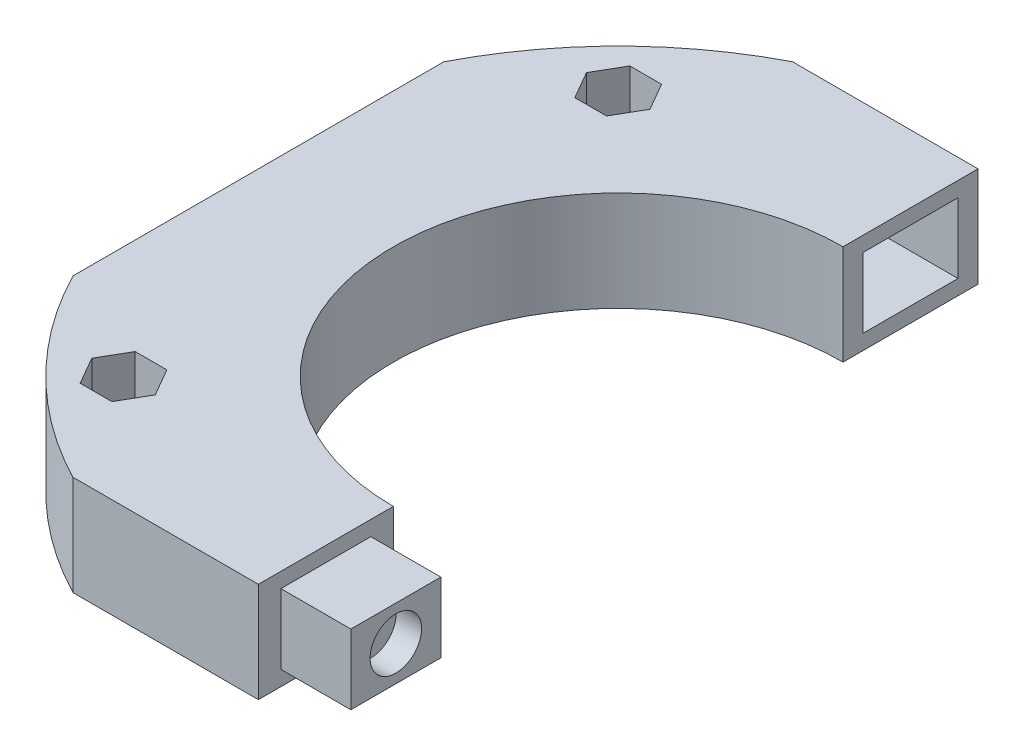
ISO-10303-21;
HEADER;
FILE_DESCRIPTION(('STEP AP214'),'2;1');
FILE_NAME('part.step','',(''),(''),'','','');
FILE_SCHEMA(('AUTOMOTIVE_DESIGN { 1 0 10303 214 1 1 1 1 }'));
ENDSEC;
DATA;
#1=APPLICATION_CONTEXT('core data for automotive mechanical design processes');
#2=APPLICATION_PROTOCOL_DEFINITION('international standard','automotive_design',2000,#1);
#3=PRODUCT_CONTEXT('',#1,'mechanical');
#4=PRODUCT('Part','Part','',(#3));
#5=PRODUCT_RELATED_PRODUCT_CATEGORY('part','',(#4));
#6=PRODUCT_DEFINITION_FORMATION('','',#4);
#7=PRODUCT_DEFINITION_CONTEXT('part definition',#1,'design');
#8=PRODUCT_DEFINITION('design','',#6,#7);
#9=PRODUCT_DEFINITION_SHAPE('','',#8);
#10=(LENGTH_UNIT() NAMED_UNIT(*) SI_UNIT(.MILLI.,.METRE.));
#11=(NAMED_UNIT(*) PLANE_ANGLE_UNIT() SI_UNIT($,.RADIAN.));
#12=(NAMED_UNIT(*) SI_UNIT($,.STERADIAN.) SOLID_ANGLE_UNIT());
#13=UNCERTAINTY_MEASURE_WITH_UNIT(LENGTH_MEASURE(1.E-05),#10,'distance_accuracy_value','');
#14=(GEOMETRIC_REPRESENTATION_CONTEXT(3) GLOBAL_UNCERTAINTY_ASSIGNED_CONTEXT((#13)) GLOBAL_UNIT_ASSIGNED_CONTEXT((#10,
#11,#12)) REPRESENTATION_CONTEXT('',''));
#15=CARTESIAN_POINT('',(0.,0.,0.));
#16=DIRECTION('',(0.,0.,1.));
#17=DIRECTION('',(1.,0.,0.));
#18=AXIS2_PLACEMENT_3D('',#15,#16,#17);
#19=CARTESIAN_POINT('',(0.,-5.,0.));
#20=DIRECTION('',(-1.,0.,0.));
#21=DIRECTION('',(0.,0.,1.));
#22=AXIS2_PLACEMENT_3D('',#19,#20,#21);
#23=PLANE('',#22);
#24=DIRECTION('',(0.,1.,0.));
#25=VECTOR('',#24,1.);
#26=CARTESIAN_POINT('',(0.,-5.,-36.));
#27=LINE('',#26,#25);
#28=CARTESIAN_POINT('',(0.,-5.,-36.));
#29=VERTEX_POINT('',#28);
#30=CARTESIAN_POINT('',(0.,5.,-36.));
#31=VERTEX_POINT('',#30);
#32=EDGE_CURVE('E11',#29,#31,#27,.T.);
#33=ORIENTED_EDGE('',*,*,#32,.T.);
#34=DIRECTION('',(0.,0.,1.));
#35=VECTOR('',#34,1.);
#36=CARTESIAN_POINT('',(0.,5.,0.));
#37=LINE('',#36,#35);
#38=CARTESIAN_POINT('',(0.,5.,-22.5));
#39=VERTEX_POINT('',#38);
#40=EDGE_CURVE('E396',#31,#39,#37,.T.);
#41=ORIENTED_EDGE('',*,*,#40,.T.);
#42=DIRECTION('',(0.,1.,0.));
#43=VECTOR('',#42,1.);
#44=CARTESIAN_POINT('',(0.,-5.,-22.5));
#45=LINE('',#44,#43);
#46=CARTESIAN_POINT('',(0.,-5.,-22.5));
#47=VERTEX_POINT('',#46);
#48=EDGE_CURVE('E54',#47,#39,#45,.T.);
#49=ORIENTED_EDGE('',*,*,#48,.F.);
#50=DIRECTION('',(0.,0.,1.));
#51=VECTOR('',#50,1.);
#52=CARTESIAN_POINT('',(0.,-5.,0.));
#53=LINE('',#52,#51);
#54=EDGE_CURVE('E420',#29,#47,#53,.T.);
#55=ORIENTED_EDGE('',*,*,#54,.F.);
#56=EDGE_LOOP('',(#33,#41,#49,#55));
#57=FACE_BOUND('',#56,.T.);
#58=DIRECTION('',(0.,0.,1.));
#59=VECTOR('',#58,1.);
#60=CARTESIAN_POINT('',(0.,-3.5,-24.5));
#61=LINE('',#60,#59);
#62=CARTESIAN_POINT('',(0.,-3.5,-34.));
#63=VERTEX_POINT('',#62);
#64=CARTESIAN_POINT('',(0.,-3.5,-24.5));
#65=VERTEX_POINT('',#64);
#66=EDGE_CURVE('E251',#63,#65,#61,.T.);
#67=ORIENTED_EDGE('',*,*,#66,.T.);
#68=DIRECTION('',(0.,1.,0.));
#69=VECTOR('',#68,1.);
#70=CARTESIAN_POINT('',(0.,-3.5,-24.5));
#71=LINE('',#70,#69);
#72=CARTESIAN_POINT('',(0.,3.5,-24.5));
#73=VERTEX_POINT('',#72);
#74=EDGE_CURVE('E236',#65,#73,#71,.T.);
#75=ORIENTED_EDGE('',*,*,#74,.T.);
#76=DIRECTION('',(0.,0.,1.));
#77=VECTOR('',#76,1.);
#78=CARTESIAN_POINT('',(0.,3.5,-24.5));
#79=LINE('',#78,#77);
#80=CARTESIAN_POINT('',(0.,3.5,-34.));
#81=VERTEX_POINT('',#80);
#82=EDGE_CURVE('E242',#81,#73,#79,.T.);
#83=ORIENTED_EDGE('',*,*,#82,.F.);
#84=DIRECTION('',(0.,1.,0.));
#85=VECTOR('',#84,1.);
#86=CARTESIAN_POINT('',(0.,-3.5,-34.));
#87=LINE('',#86,#85);
#88=EDGE_CURVE('E644',#63,#81,#87,.T.);
#89=ORIENTED_EDGE('',*,*,#88,.F.);
#90=EDGE_LOOP('',(#67,#75,#83,#89));
#91=FACE_BOUND('',#90,.T.);
#92=ADVANCED_FACE('F45',(#57,#91),#23,.F.);
#93=CARTESIAN_POINT('',(-24.7487373415292,-5.,24.7487373415292));
#94=DIRECTION('',(0.,1.,0.));
#95=DIRECTION('',(0.,0.,1.));
#96=AXIS2_PLACEMENT_3D('',#93,#94,#95);
#97=CYLINDRICAL_SURFACE('',#96,1.5);
#98=CARTESIAN_POINT('',(-24.7487373415292,-5.,24.7487373415292));
#99=DIRECTION('',(0.,1.,0.));
#100=DIRECTION('',(0.,0.,1.));
#101=AXIS2_PLACEMENT_3D('',#98,#99,#100);
#102=CIRCLE('',#101,1.5);
#103=CARTESIAN_POINT('',(-24.7487373415292,-5.,26.2487373415292));
#104=VERTEX_POINT('',#103);
#105=EDGE_CURVE('E399',#104,#104,#102,.T.);
#106=ORIENTED_EDGE('',*,*,#105,.F.);
#107=EDGE_LOOP('',(#106));
#108=FACE_BOUND('',#107,.T.);
#109=CARTESIAN_POINT('',(-24.7487373415292,0.,24.7487373415292));
#110=DIRECTION('',(0.,1.,0.));
#111=DIRECTION('',(0.,0.,1.));
#112=AXIS2_PLACEMENT_3D('',#109,#110,#111);
#113=CIRCLE('',#112,1.5);
#114=CARTESIAN_POINT('',(-24.7487373415292,0.,26.2487373415292));
#115=VERTEX_POINT('',#114);
#116=EDGE_CURVE('E49',#115,#115,#113,.F.);
#117=ORIENTED_EDGE('',*,*,#116,.F.);
#118=EDGE_LOOP('',(#117));
#119=FACE_BOUND('',#118,.T.);
#120=ADVANCED_FACE('F47',(#108,#119),#97,.F.);
#121=CARTESIAN_POINT('',(0.,5.,0.));
#122=DIRECTION('',(0.,1.,0.));
#123=DIRECTION('',(0.,0.,1.));
#124=AXIS2_PLACEMENT_3D('',#121,#122,#123);
#125=PLANE('',#124);
#126=DIRECTION('',(1.,0.,0.));
#127=VECTOR('',#126,1.);
#128=CARTESIAN_POINT('',(0.,5.,-36.));
#129=LINE('',#128,#127);
#130=CARTESIAN_POINT('',(-18.5539753152795,5.,-36.));
#131=VERTEX_POINT('',#130);
#132=EDGE_CURVE('E379',#131,#31,#129,.T.);
#133=ORIENTED_EDGE('',*,*,#132,.F.);
#134=CARTESIAN_POINT('',(0.,5.,0.));
#135=DIRECTION('',(0.,1.,0.));
#136=DIRECTION('',(0.,0.,1.));
#137=AXIS2_PLACEMENT_3D('',#134,#135,#136);
#138=CIRCLE('',#137,40.5);
#139=CARTESIAN_POINT('',(-36.,5.,-18.5539753152794));
#140=VERTEX_POINT('',#139);
#141=EDGE_CURVE('E382',#131,#140,#138,.T.);
#142=ORIENTED_EDGE('',*,*,#141,.T.);
#143=DIRECTION('',(0.,0.,-1.));
#144=VECTOR('',#143,1.);
#145=CARTESIAN_POINT('',(-36.,5.,0.));
#146=LINE('',#145,#144);
#147=CARTESIAN_POINT('',(-36.,5.,18.5539753152795));
#148=VERTEX_POINT('',#147);
#149=EDGE_CURVE('E385',#148,#140,#146,.T.);
#150=ORIENTED_EDGE('',*,*,#149,.F.);
#151=CARTESIAN_POINT('',(-18.5539753152795,5.,36.));
#152=VERTEX_POINT('',#151);
#153=EDGE_CURVE('E386',#148,#152,#138,.T.);
#154=ORIENTED_EDGE('',*,*,#153,.T.);
#155=DIRECTION('',(1.,0.,0.));
#156=VECTOR('',#155,1.);
#157=CARTESIAN_POINT('',(0.,5.,36.));
#158=LINE('',#157,#156);
#159=CARTESIAN_POINT('',(0.,5.,36.));
#160=VERTEX_POINT('',#159);
#161=EDGE_CURVE('E389',#152,#160,#158,.T.);
#162=ORIENTED_EDGE('',*,*,#161,.T.);
#163=CARTESIAN_POINT('',(0.,5.,22.5));
#164=VERTEX_POINT('',#163);
#165=EDGE_CURVE('E392',#164,#160,#37,.T.);
#166=ORIENTED_EDGE('',*,*,#165,.F.);
#167=CARTESIAN_POINT('',(0.,5.,0.));
#168=DIRECTION('',(0.,1.,0.));
#169=DIRECTION('',(0.,0.,1.));
#170=AXIS2_PLACEMENT_3D('',#167,#168,#169);
#171=CIRCLE('',#170,22.5);
#172=EDGE_CURVE('E395',#39,#164,#171,.T.);
#173=ORIENTED_EDGE('',*,*,#172,.F.);
#174=ORIENTED_EDGE('',*,*,#40,.F.);
#175=EDGE_LOOP('',(#133,#142,#150,#154,#162,#166,#173,#174));
#176=FACE_BOUND('',#175,.T.);
#177=DIRECTION('',(-0.500000000000006,0.,-0.866025403784435));
#178=VECTOR('',#177,1.);
#179=CARTESIAN_POINT('',(-21.5733108609862,5.,-24.7487373415292));
#180=LINE('',#179,#178);
#181=CARTESIAN_POINT('',(-21.5733108609862,5.,-24.7487373415292));
#182=VERTEX_POINT('',#181);
#183=CARTESIAN_POINT('',(-23.1610241012577,5.,-27.4987373415292));
#184=VERTEX_POINT('',#183);
#185=EDGE_CURVE('E350',#182,#184,#180,.T.);
#186=ORIENTED_EDGE('',*,*,#185,.F.);
#187=DIRECTION('',(0.499999999999994,0.,-0.866025403784442));
#188=VECTOR('',#187,1.);
#189=CARTESIAN_POINT('',(-23.1610241012577,5.,-21.9987373415292));
#190=LINE('',#189,#188);
#191=CARTESIAN_POINT('',(-23.1610241012577,5.,-21.9987373415292));
#192=VERTEX_POINT('',#191);
#193=EDGE_CURVE('E334',#192,#182,#190,.T.);
#194=ORIENTED_EDGE('',*,*,#193,.F.);
#195=DIRECTION('',(1.,0.,0.));
#196=VECTOR('',#195,1.);
#197=CARTESIAN_POINT('',(-26.3364505818006,5.,-21.9987373415292));
#198=LINE('',#197,#196);
#199=CARTESIAN_POINT('',(-26.3364505818006,5.,-21.9987373415292));
#200=VERTEX_POINT('',#199);
#201=EDGE_CURVE('E361',#200,#192,#198,.T.);
#202=ORIENTED_EDGE('',*,*,#201,.F.);
#203=DIRECTION('',(0.500000000000006,0.,0.866025403784435));
#204=VECTOR('',#203,1.);
#205=CARTESIAN_POINT('',(-27.9241638220721,5.,-24.7487373415291));
#206=LINE('',#205,#204);
#207=CARTESIAN_POINT('',(-27.9241638220721,5.,-24.7487373415291));
#208=VERTEX_POINT('',#207);
#209=EDGE_CURVE('E358',#208,#200,#206,.T.);
#210=ORIENTED_EDGE('',*,*,#209,.F.);
#211=DIRECTION('',(-0.499999999999993,0.,0.866025403784443));
#212=VECTOR('',#211,1.);
#213=CARTESIAN_POINT('',(-26.3364505818006,5.,-27.4987373415292));
#214=LINE('',#213,#212);
#215=CARTESIAN_POINT('',(-26.3364505818006,5.,-27.4987373415292));
#216=VERTEX_POINT('',#215);
#217=EDGE_CURVE('E355',#216,#208,#214,.T.);
#218=ORIENTED_EDGE('',*,*,#217,.F.);
#219=DIRECTION('',(-1.,0.,0.));
#220=VECTOR('',#219,1.);
#221=CARTESIAN_POINT('',(-23.1610241012577,5.,-27.4987373415292));
#222=LINE('',#221,#220);
#223=EDGE_CURVE('E352',#184,#216,#222,.T.);
#224=ORIENTED_EDGE('',*,*,#223,.F.);
#225=EDGE_LOOP('',(#186,#194,#202,#210,#218,#224));
#226=FACE_BOUND('',#225,.T.);
#227=DIRECTION('',(0.499999999999994,0.,0.866025403784442));
#228=VECTOR('',#227,1.);
#229=CARTESIAN_POINT('',(-23.1610241012577,5.,21.9987373415292));
#230=LINE('',#229,#228);
#231=CARTESIAN_POINT('',(-23.1610241012577,5.,21.9987373415292));
#232=VERTEX_POINT('',#231);
#233=CARTESIAN_POINT('',(-21.5733108609862,5.,24.7487373415292));
#234=VERTEX_POINT('',#233);
#235=EDGE_CURVE('E303',#232,#234,#230,.T.);
#236=ORIENTED_EDGE('',*,*,#235,.T.);
#237=DIRECTION('',(-0.500000000000006,0.,0.866025403784435));
#238=VECTOR('',#237,1.);
#239=CARTESIAN_POINT('',(-21.5733108609862,5.,24.7487373415292));
#240=LINE('',#239,#238);
#241=CARTESIAN_POINT('',(-23.1610241012577,5.,27.4987373415292));
#242=VERTEX_POINT('',#241);
#243=EDGE_CURVE('E285',#234,#242,#240,.T.);
#244=ORIENTED_EDGE('',*,*,#243,.T.);
#245=DIRECTION('',(-1.,0.,0.));
#246=VECTOR('',#245,1.);
#247=CARTESIAN_POINT('',(-23.1610241012577,5.,27.4987373415292));
#248=LINE('',#247,#246);
#249=CARTESIAN_POINT('',(-26.3364505818006,5.,27.4987373415292));
#250=VERTEX_POINT('',#249);
#251=EDGE_CURVE('E290',#242,#250,#248,.T.);
#252=ORIENTED_EDGE('',*,*,#251,.T.);
#253=DIRECTION('',(-0.499999999999993,0.,-0.866025403784443));
#254=VECTOR('',#253,1.);
#255=CARTESIAN_POINT('',(-26.3364505818006,5.,27.4987373415292));
#256=LINE('',#255,#254);
#257=CARTESIAN_POINT('',(-27.9241638220721,5.,24.7487373415291));
#258=VERTEX_POINT('',#257);
#259=EDGE_CURVE('E312',#250,#258,#256,.T.);
#260=ORIENTED_EDGE('',*,*,#259,.T.);
#261=DIRECTION('',(0.500000000000006,0.,-0.866025403784435));
#262=VECTOR('',#261,1.);
#263=CARTESIAN_POINT('',(-27.9241638220721,5.,24.7487373415291));
#264=LINE('',#263,#262);
#265=CARTESIAN_POINT('',(-26.3364505818006,5.,21.9987373415292));
#266=VERTEX_POINT('',#265);
#267=EDGE_CURVE('E309',#258,#266,#264,.T.);
#268=ORIENTED_EDGE('',*,*,#267,.T.);
#269=DIRECTION('',(1.,0.,0.));
#270=VECTOR('',#269,1.);
#271=CARTESIAN_POINT('',(-26.3364505818006,5.,21.9987373415292));
#272=LINE('',#271,#270);
#273=EDGE_CURVE('E306',#266,#232,#272,.T.);
#274=ORIENTED_EDGE('',*,*,#273,.T.);
#275=EDGE_LOOP('',(#236,#244,#252,#260,#268,#274));
#276=FACE_BOUND('',#275,.T.);
#277=ADVANCED_FACE('F442',(#176,#226,#276),#125,.T.);
#278=CARTESIAN_POINT('',(-24.7487373415292,-5.,-24.7487373415292));
#279=DIRECTION('',(0.,1.,0.));
#280=DIRECTION('',(0.,0.,1.));
#281=AXIS2_PLACEMENT_3D('',#278,#279,#280);
#282=CYLINDRICAL_SURFACE('',#281,1.5);
#283=CARTESIAN_POINT('',(-24.7487373415292,-5.,-24.7487373415292));
#284=DIRECTION('',(0.,1.,0.));
#285=DIRECTION('',(0.,0.,1.));
#286=AXIS2_PLACEMENT_3D('',#283,#284,#285);
#287=CIRCLE('',#286,1.5);
#288=CARTESIAN_POINT('',(-24.7487373415292,-5.,-23.2487373415292));
#289=VERTEX_POINT('',#288);
#290=EDGE_CURVE('E402',#289,#289,#287,.T.);
#291=ORIENTED_EDGE('',*,*,#290,.F.);
#292=EDGE_LOOP('',(#291));
#293=FACE_BOUND('',#292,.T.);
#294=CARTESIAN_POINT('',(-24.7487373415292,0.,-24.7487373415292));
#295=DIRECTION('',(0.,1.,0.));
#296=DIRECTION('',(0.,0.,1.));
#297=AXIS2_PLACEMENT_3D('',#294,#295,#296);
#298=CIRCLE('',#297,1.5);
#299=CARTESIAN_POINT('',(-24.7487373415292,0.,-23.2487373415292));
#300=VERTEX_POINT('',#299);
#301=EDGE_CURVE('E368',#300,#300,#298,.F.);
#302=ORIENTED_EDGE('',*,*,#301,.F.);
#303=EDGE_LOOP('',(#302));
#304=FACE_BOUND('',#303,.T.);
#305=ADVANCED_FACE('F439',(#293,#304),#282,.F.);
#306=CARTESIAN_POINT('',(0.,-5.,-36.));
#307=DIRECTION('',(0.,0.,1.));
#308=DIRECTION('',(1.,0.,0.));
#309=AXIS2_PLACEMENT_3D('',#306,#307,#308);
#310=PLANE('',#309);
#311=DIRECTION('',(0.,1.,0.));
#312=VECTOR('',#311,1.);
#313=CARTESIAN_POINT('',(-18.5539753152795,-5.,-36.));
#314=LINE('',#313,#312);
#315=CARTESIAN_POINT('',(-18.5539753152795,-5.,-36.));
#316=VERTEX_POINT('',#315);
#317=EDGE_CURVE('E433',#316,#131,#314,.T.);
#318=ORIENTED_EDGE('',*,*,#317,.T.);
#319=ORIENTED_EDGE('',*,*,#132,.T.);
#320=ORIENTED_EDGE('',*,*,#32,.F.);
#321=DIRECTION('',(1.,0.,0.));
#322=VECTOR('',#321,1.);
#323=CARTESIAN_POINT('',(0.,-5.,-36.));
#324=LINE('',#323,#322);
#325=EDGE_CURVE('E405',#316,#29,#324,.T.);
#326=ORIENTED_EDGE('',*,*,#325,.F.);
#327=EDGE_LOOP('',(#318,#319,#320,#326));
#328=FACE_BOUND('',#327,.T.);
#329=ADVANCED_FACE('F441',(#328),#310,.F.);
#330=CARTESIAN_POINT('',(0.,-5.,0.));
#331=DIRECTION('',(0.,1.,0.));
#332=DIRECTION('',(0.,0.,1.));
#333=AXIS2_PLACEMENT_3D('',#330,#331,#332);
#334=CYLINDRICAL_SURFACE('',#333,22.5);
#335=ORIENTED_EDGE('',*,*,#48,.T.);
#336=ORIENTED_EDGE('',*,*,#172,.T.);
#337=DIRECTION('',(0.,1.,0.));
#338=VECTOR('',#337,1.);
#339=CARTESIAN_POINT('',(0.,-5.,22.5));
#340=LINE('',#339,#338);
#341=CARTESIAN_POINT('',(0.,-5.,22.5));
#342=VERTEX_POINT('',#341);
#343=EDGE_CURVE('E423',#342,#164,#340,.T.);
#344=ORIENTED_EDGE('',*,*,#343,.F.);
#345=CARTESIAN_POINT('',(0.,-5.,0.));
#346=DIRECTION('',(0.,1.,0.));
#347=DIRECTION('',(0.,0.,1.));
#348=AXIS2_PLACEMENT_3D('',#345,#346,#347);
#349=CIRCLE('',#348,22.5);
#350=EDGE_CURVE('E419',#47,#342,#349,.T.);
#351=ORIENTED_EDGE('',*,*,#350,.F.);
#352=EDGE_LOOP('',(#335,#336,#344,#351));
#353=FACE_BOUND('',#352,.T.);
#354=ADVANCED_FACE('F449',(#353),#334,.F.);
#355=DIRECTION('',(0.,-1.,0.));
#356=VECTOR('',#355,1.);
#357=CARTESIAN_POINT('',(0.,3.5,33.75));
#358=LINE('',#357,#356);
#359=CARTESIAN_POINT('',(0.,3.5,33.75));
#360=VERTEX_POINT('',#359);
#361=CARTESIAN_POINT('',(0.,-3.5,33.75));
#362=VERTEX_POINT('',#361);
#363=EDGE_CURVE('E70',#360,#362,#358,.T.);
#364=ORIENTED_EDGE('',*,*,#363,.F.);
#365=DIRECTION('',(0.,0.,1.));
#366=VECTOR('',#365,1.);
#367=CARTESIAN_POINT('',(0.,3.5,24.75));
#368=LINE('',#367,#366);
#369=CARTESIAN_POINT('',(0.,3.5,24.75));
#370=VERTEX_POINT('',#369);
#371=EDGE_CURVE('E268',#370,#360,#368,.T.);
#372=ORIENTED_EDGE('',*,*,#371,.F.);
#373=DIRECTION('',(0.,-1.,0.));
#374=VECTOR('',#373,1.);
#375=CARTESIAN_POINT('',(0.,3.5,24.75));
#376=LINE('',#375,#374);
#377=CARTESIAN_POINT('',(0.,-3.5,24.75));
#378=VERTEX_POINT('',#377);
#379=EDGE_CURVE('E278',#370,#378,#376,.T.);
#380=ORIENTED_EDGE('',*,*,#379,.T.);
#381=DIRECTION('',(0.,0.,1.));
#382=VECTOR('',#381,1.);
#383=CARTESIAN_POINT('',(0.,-3.5,24.75));
#384=LINE('',#383,#382);
#385=EDGE_CURVE('E252',#378,#362,#384,.T.);
#386=ORIENTED_EDGE('',*,*,#385,.T.);
#387=EDGE_LOOP('',(#364,#372,#380,#386));
#388=FACE_BOUND('',#387,.T.);
#389=ORIENTED_EDGE('',*,*,#343,.T.);
#390=ORIENTED_EDGE('',*,*,#165,.T.);
#391=DIRECTION('',(0.,1.,0.));
#392=VECTOR('',#391,1.);
#393=CARTESIAN_POINT('',(0.,-5.,36.));
#394=LINE('',#393,#392);
#395=CARTESIAN_POINT('',(0.,-5.,36.));
#396=VERTEX_POINT('',#395);
#397=EDGE_CURVE('E425',#396,#160,#394,.T.);
#398=ORIENTED_EDGE('',*,*,#397,.F.);
#399=EDGE_CURVE('E417',#342,#396,#53,.T.);
#400=ORIENTED_EDGE('',*,*,#399,.F.);
#401=EDGE_LOOP('',(#389,#390,#398,#400));
#402=FACE_BOUND('',#401,.T.);
#403=ADVANCED_FACE('F459',(#388,#402),#23,.F.);
#404=CARTESIAN_POINT('',(0.,-5.,36.));
#405=DIRECTION('',(0.,0.,1.));
#406=DIRECTION('',(1.,0.,0.));
#407=AXIS2_PLACEMENT_3D('',#404,#405,#406);
#408=PLANE('',#407);
#409=ORIENTED_EDGE('',*,*,#397,.T.);
#410=ORIENTED_EDGE('',*,*,#161,.F.);
#411=DIRECTION('',(0.,1.,0.));
#412=VECTOR('',#411,1.);
#413=CARTESIAN_POINT('',(-18.5539753152795,-5.,36.));
#414=LINE('',#413,#412);
#415=CARTESIAN_POINT('',(-18.5539753152795,-5.,36.));
#416=VERTEX_POINT('',#415);
#417=EDGE_CURVE('E427',#416,#152,#414,.T.);
#418=ORIENTED_EDGE('',*,*,#417,.F.);
#419=DIRECTION('',(1.,0.,0.));
#420=VECTOR('',#419,1.);
#421=CARTESIAN_POINT('',(0.,-5.,36.));
#422=LINE('',#421,#420);
#423=EDGE_CURVE('E414',#416,#396,#422,.T.);
#424=ORIENTED_EDGE('',*,*,#423,.T.);
#425=EDGE_LOOP('',(#409,#410,#418,#424));
#426=FACE_BOUND('',#425,.T.);
#427=ADVANCED_FACE('F469',(#426),#408,.T.);
#428=CARTESIAN_POINT('',(0.,-5.,0.));
#429=DIRECTION('',(0.,1.,0.));
#430=DIRECTION('',(0.,0.,1.));
#431=AXIS2_PLACEMENT_3D('',#428,#429,#430);
#432=CYLINDRICAL_SURFACE('',#431,40.5);
#433=ORIENTED_EDGE('',*,*,#417,.T.);
#434=ORIENTED_EDGE('',*,*,#153,.F.);
#435=DIRECTION('',(0.,1.,0.));
#436=VECTOR('',#435,1.);
#437=CARTESIAN_POINT('',(-36.,-5.,18.5539753152795));
#438=LINE('',#437,#436);
#439=CARTESIAN_POINT('',(-36.,-5.,18.5539753152795));
#440=VERTEX_POINT('',#439);
#441=EDGE_CURVE('E429',#440,#148,#438,.T.);
#442=ORIENTED_EDGE('',*,*,#441,.F.);
#443=CARTESIAN_POINT('',(0.,-5.,0.));
#444=DIRECTION('',(0.,1.,0.));
#445=DIRECTION('',(0.,0.,1.));
#446=AXIS2_PLACEMENT_3D('',#443,#444,#445);
#447=CIRCLE('',#446,40.5);
#448=EDGE_CURVE('E412',#440,#416,#447,.T.);
#449=ORIENTED_EDGE('',*,*,#448,.T.);
#450=EDGE_LOOP('',(#433,#434,#442,#449));
#451=FACE_BOUND('',#450,.T.);
#452=ADVANCED_FACE('F475',(#451),#432,.T.);
#453=CARTESIAN_POINT('',(-36.,-5.,0.));
#454=DIRECTION('',(1.,0.,0.));
#455=DIRECTION('',(0.,0.,-1.));
#456=AXIS2_PLACEMENT_3D('',#453,#454,#455);
#457=PLANE('',#456);
#458=ORIENTED_EDGE('',*,*,#441,.T.);
#459=ORIENTED_EDGE('',*,*,#149,.T.);
#460=DIRECTION('',(0.,1.,0.));
#461=VECTOR('',#460,1.);
#462=CARTESIAN_POINT('',(-36.,-5.,-18.5539753152794));
#463=LINE('',#462,#461);
#464=CARTESIAN_POINT('',(-36.,-5.,-18.5539753152794));
#465=VERTEX_POINT('',#464);
#466=EDGE_CURVE('E431',#465,#140,#463,.T.);
#467=ORIENTED_EDGE('',*,*,#466,.F.);
#468=DIRECTION('',(0.,0.,-1.));
#469=VECTOR('',#468,1.);
#470=CARTESIAN_POINT('',(-36.,-5.,0.));
#471=LINE('',#470,#469);
#472=EDGE_CURVE('E411',#440,#465,#471,.T.);
#473=ORIENTED_EDGE('',*,*,#472,.F.);
#474=EDGE_LOOP('',(#458,#459,#467,#473));
#475=FACE_BOUND('',#474,.T.);
#476=ADVANCED_FACE('F504',(#475),#457,.F.);
#477=ORIENTED_EDGE('',*,*,#466,.T.);
#478=ORIENTED_EDGE('',*,*,#141,.F.);
#479=ORIENTED_EDGE('',*,*,#317,.F.);
#480=EDGE_CURVE('E408',#316,#465,#447,.T.);
#481=ORIENTED_EDGE('',*,*,#480,.T.);
#482=EDGE_LOOP('',(#477,#478,#479,#481));
#483=FACE_BOUND('',#482,.T.);
#484=ADVANCED_FACE('F500',(#483),#432,.T.);
#485=CARTESIAN_POINT('',(0.,-5.,0.));
#486=DIRECTION('',(0.,1.,0.));
#487=DIRECTION('',(0.,0.,1.));
#488=AXIS2_PLACEMENT_3D('',#485,#486,#487);
#489=PLANE('',#488);
#490=ORIENTED_EDGE('',*,*,#105,.T.);
#491=EDGE_LOOP('',(#490));
#492=FACE_BOUND('',#491,.T.);
#493=ORIENTED_EDGE('',*,*,#290,.T.);
#494=EDGE_LOOP('',(#493));
#495=FACE_BOUND('',#494,.T.);
#496=ORIENTED_EDGE('',*,*,#325,.T.);
#497=ORIENTED_EDGE('',*,*,#54,.T.);
#498=ORIENTED_EDGE('',*,*,#350,.T.);
#499=ORIENTED_EDGE('',*,*,#399,.T.);
#500=ORIENTED_EDGE('',*,*,#423,.F.);
#501=ORIENTED_EDGE('',*,*,#448,.F.);
#502=ORIENTED_EDGE('',*,*,#472,.T.);
#503=ORIENTED_EDGE('',*,*,#480,.F.);
#504=EDGE_LOOP('',(#496,#497,#498,#499,#500,#501,#502,#503));
#505=FACE_BOUND('',#504,.T.);
#506=ADVANCED_FACE('F511',(#492,#495,#505),#489,.F.);
#507=CARTESIAN_POINT('',(0.,0.,0.));
#508=DIRECTION('',(0.,1.,0.));
#509=DIRECTION('',(0.,0.,1.));
#510=AXIS2_PLACEMENT_3D('',#507,#508,#509);
#511=PLANE('',#510);
#512=DIRECTION('',(-0.500000000000006,0.,-0.866025403784435));
#513=VECTOR('',#512,1.);
#514=CARTESIAN_POINT('',(-21.5733108609862,0.,-24.7487373415292));
#515=LINE('',#514,#513);
#516=CARTESIAN_POINT('',(-21.5733108609862,0.,-24.7487373415292));
#517=VERTEX_POINT('',#516);
#518=CARTESIAN_POINT('',(-23.1610241012577,0.,-27.4987373415292));
#519=VERTEX_POINT('',#518);
#520=EDGE_CURVE('E330',#517,#519,#515,.T.);
#521=ORIENTED_EDGE('',*,*,#520,.T.);
#522=DIRECTION('',(-1.,0.,0.));
#523=VECTOR('',#522,1.);
#524=CARTESIAN_POINT('',(-23.1610241012577,0.,-27.4987373415292));
#525=LINE('',#524,#523);
#526=CARTESIAN_POINT('',(-26.3364505818006,0.,-27.4987373415292));
#527=VERTEX_POINT('',#526);
#528=EDGE_CURVE('E333',#519,#527,#525,.T.);
#529=ORIENTED_EDGE('',*,*,#528,.T.);
#530=DIRECTION('',(-0.499999999999993,0.,0.866025403784443));
#531=VECTOR('',#530,1.);
#532=CARTESIAN_POINT('',(-26.3364505818006,0.,-27.4987373415292));
#533=LINE('',#532,#531);
#534=CARTESIAN_POINT('',(-27.9241638220721,0.,-24.7487373415291));
#535=VERTEX_POINT('',#534);
#536=EDGE_CURVE('E337',#527,#535,#533,.T.);
#537=ORIENTED_EDGE('',*,*,#536,.T.);
#538=DIRECTION('',(0.500000000000006,0.,0.866025403784435));
#539=VECTOR('',#538,1.);
#540=CARTESIAN_POINT('',(-27.9241638220721,0.,-24.7487373415291));
#541=LINE('',#540,#539);
#542=CARTESIAN_POINT('',(-26.3364505818006,0.,-21.9987373415292));
#543=VERTEX_POINT('',#542);
#544=EDGE_CURVE('E340',#535,#543,#541,.T.);
#545=ORIENTED_EDGE('',*,*,#544,.T.);
#546=DIRECTION('',(1.,0.,0.));
#547=VECTOR('',#546,1.);
#548=CARTESIAN_POINT('',(-26.3364505818006,0.,-21.9987373415292));
#549=LINE('',#548,#547);
#550=CARTESIAN_POINT('',(-23.1610241012577,0.,-21.9987373415292));
#551=VERTEX_POINT('',#550);
#552=EDGE_CURVE('E343',#543,#551,#549,.T.);
#553=ORIENTED_EDGE('',*,*,#552,.T.);
#554=DIRECTION('',(0.499999999999994,0.,-0.866025403784442));
#555=VECTOR('',#554,1.);
#556=CARTESIAN_POINT('',(-23.1610241012577,0.,-21.9987373415292));
#557=LINE('',#556,#555);
#558=EDGE_CURVE('E346',#551,#517,#557,.T.);
#559=ORIENTED_EDGE('',*,*,#558,.T.);
#560=EDGE_LOOP('',(#521,#529,#537,#545,#553,#559));
#561=FACE_BOUND('',#560,.T.);
#562=ORIENTED_EDGE('',*,*,#301,.T.);
#563=EDGE_LOOP('',(#562));
#564=FACE_BOUND('',#563,.T.);
#565=ADVANCED_FACE('F437',(#561,#564),#511,.T.);
#566=CARTESIAN_POINT('',(-21.5733108609862,0.,-24.7487373415292));
#567=DIRECTION('',(0.866025403784435,0.,-0.500000000000006));
#568=DIRECTION('',(-0.500000000000007,0.,-0.866025403784435));
#569=AXIS2_PLACEMENT_3D('',#566,#567,#568);
#570=PLANE('',#569);
#571=ORIENTED_EDGE('',*,*,#185,.T.);
#572=DIRECTION('',(0.,1.,0.));
#573=VECTOR('',#572,1.);
#574=CARTESIAN_POINT('',(-23.1610241012577,0.,-27.4987373415292));
#575=LINE('',#574,#573);
#576=EDGE_CURVE('E349',#519,#184,#575,.T.);
#577=ORIENTED_EDGE('',*,*,#576,.F.);
#578=ORIENTED_EDGE('',*,*,#520,.F.);
#579=DIRECTION('',(0.,1.,0.));
#580=VECTOR('',#579,1.);
#581=CARTESIAN_POINT('',(-21.5733108609862,0.,-24.7487373415292));
#582=LINE('',#581,#580);
#583=EDGE_CURVE('E366',#517,#182,#582,.T.);
#584=ORIENTED_EDGE('',*,*,#583,.T.);
#585=EDGE_LOOP('',(#571,#577,#578,#584));
#586=FACE_BOUND('',#585,.T.);
#587=ADVANCED_FACE('F516',(#586),#570,.F.);
#588=CARTESIAN_POINT('',(-23.1610241012577,0.,-21.9987373415292));
#589=DIRECTION('',(0.866025403784442,0.,0.499999999999994));
#590=DIRECTION('',(0.499999999999994,0.,-0.866025403784442));
#591=AXIS2_PLACEMENT_3D('',#588,#589,#590);
#592=PLANE('',#591);
#593=ORIENTED_EDGE('',*,*,#193,.T.);
#594=ORIENTED_EDGE('',*,*,#583,.F.);
#595=ORIENTED_EDGE('',*,*,#558,.F.);
#596=DIRECTION('',(0.,1.,0.));
#597=VECTOR('',#596,1.);
#598=CARTESIAN_POINT('',(-23.1610241012577,0.,-21.9987373415292));
#599=LINE('',#598,#597);
#600=EDGE_CURVE('E369',#551,#192,#599,.T.);
#601=ORIENTED_EDGE('',*,*,#600,.T.);
#602=EDGE_LOOP('',(#593,#594,#595,#601));
#603=FACE_BOUND('',#602,.T.);
#604=ADVANCED_FACE('F524',(#603),#592,.F.);
#605=CARTESIAN_POINT('',(-26.3364505818006,0.,-21.9987373415292));
#606=DIRECTION('',(0.,0.,1.));
#607=DIRECTION('',(1.,0.,0.));
#608=AXIS2_PLACEMENT_3D('',#605,#606,#607);
#609=PLANE('',#608);
#610=ORIENTED_EDGE('',*,*,#201,.T.);
#611=ORIENTED_EDGE('',*,*,#600,.F.);
#612=ORIENTED_EDGE('',*,*,#552,.F.);
#613=DIRECTION('',(0.,1.,0.));
#614=VECTOR('',#613,1.);
#615=CARTESIAN_POINT('',(-26.3364505818006,0.,-21.9987373415292));
#616=LINE('',#615,#614);
#617=EDGE_CURVE('E371',#543,#200,#616,.T.);
#618=ORIENTED_EDGE('',*,*,#617,.T.);
#619=EDGE_LOOP('',(#610,#611,#612,#618));
#620=FACE_BOUND('',#619,.T.);
#621=ADVANCED_FACE('F538',(#620),#609,.F.);
#622=CARTESIAN_POINT('',(-27.9241638220721,0.,-24.7487373415291));
#623=DIRECTION('',(-0.866025403784435,0.,0.500000000000006));
#624=DIRECTION('',(0.500000000000006,0.,0.866025403784435));
#625=AXIS2_PLACEMENT_3D('',#622,#623,#624);
#626=PLANE('',#625);
#627=ORIENTED_EDGE('',*,*,#209,.T.);
#628=ORIENTED_EDGE('',*,*,#617,.F.);
#629=ORIENTED_EDGE('',*,*,#544,.F.);
#630=DIRECTION('',(0.,1.,0.));
#631=VECTOR('',#630,1.);
#632=CARTESIAN_POINT('',(-27.9241638220721,0.,-24.7487373415291));
#633=LINE('',#632,#631);
#634=EDGE_CURVE('E373',#535,#208,#633,.T.);
#635=ORIENTED_EDGE('',*,*,#634,.T.);
#636=EDGE_LOOP('',(#627,#628,#629,#635));
#637=FACE_BOUND('',#636,.T.);
#638=ADVANCED_FACE('F534',(#637),#626,.F.);
#639=CARTESIAN_POINT('',(-26.3364505818006,0.,-27.4987373415292));
#640=DIRECTION('',(-0.866025403784442,0.,-0.499999999999993));
#641=DIRECTION('',(-0.499999999999993,0.,0.866025403784442));
#642=AXIS2_PLACEMENT_3D('',#639,#640,#641);
#643=PLANE('',#642);
#644=ORIENTED_EDGE('',*,*,#217,.T.);
#645=ORIENTED_EDGE('',*,*,#634,.F.);
#646=ORIENTED_EDGE('',*,*,#536,.F.);
#647=DIRECTION('',(0.,1.,0.));
#648=VECTOR('',#647,1.);
#649=CARTESIAN_POINT('',(-26.3364505818006,0.,-27.4987373415292));
#650=LINE('',#649,#648);
#651=EDGE_CURVE('E375',#527,#216,#650,.T.);
#652=ORIENTED_EDGE('',*,*,#651,.T.);
#653=EDGE_LOOP('',(#644,#645,#646,#652));
#654=FACE_BOUND('',#653,.T.);
#655=ADVANCED_FACE('F530',(#654),#643,.F.);
#656=CARTESIAN_POINT('',(-23.1610241012577,0.,-27.4987373415292));
#657=DIRECTION('',(0.,0.,-1.));
#658=DIRECTION('',(-1.,0.,0.));
#659=AXIS2_PLACEMENT_3D('',#656,#657,#658);
#660=PLANE('',#659);
#661=ORIENTED_EDGE('',*,*,#223,.T.);
#662=ORIENTED_EDGE('',*,*,#651,.F.);
#663=ORIENTED_EDGE('',*,*,#528,.F.);
#664=ORIENTED_EDGE('',*,*,#576,.T.);
#665=EDGE_LOOP('',(#661,#662,#663,#664));
#666=FACE_BOUND('',#665,.T.);
#667=ADVANCED_FACE('F526',(#666),#660,.F.);
#668=CARTESIAN_POINT('',(0.,0.,0.));
#669=DIRECTION('',(0.,1.,0.));
#670=DIRECTION('',(0.,0.,-1.));
#671=AXIS2_PLACEMENT_3D('',#668,#669,#670);
#672=PLANE('',#671);
#673=DIRECTION('',(-0.500000000000006,0.,0.866025403784435));
#674=VECTOR('',#673,1.);
#675=CARTESIAN_POINT('',(-21.5733108609862,0.,24.7487373415292));
#676=LINE('',#675,#674);
#677=CARTESIAN_POINT('',(-21.5733108609862,0.,24.7487373415292));
#678=VERTEX_POINT('',#677);
#679=CARTESIAN_POINT('',(-23.1610241012577,0.,27.4987373415292));
#680=VERTEX_POINT('',#679);
#681=EDGE_CURVE('E286',#678,#680,#676,.T.);
#682=ORIENTED_EDGE('',*,*,#681,.F.);
#683=DIRECTION('',(0.499999999999994,0.,0.866025403784442));
#684=VECTOR('',#683,1.);
#685=CARTESIAN_POINT('',(-23.1610241012577,0.,21.9987373415292));
#686=LINE('',#685,#684);
#687=CARTESIAN_POINT('',(-23.1610241012577,0.,21.9987373415292));
#688=VERTEX_POINT('',#687);
#689=EDGE_CURVE('E289',#688,#678,#686,.T.);
#690=ORIENTED_EDGE('',*,*,#689,.F.);
#691=DIRECTION('',(1.,0.,0.));
#692=VECTOR('',#691,1.);
#693=CARTESIAN_POINT('',(-26.3364505818006,0.,21.9987373415292));
#694=LINE('',#693,#692);
#695=CARTESIAN_POINT('',(-26.3364505818006,0.,21.9987373415292));
#696=VERTEX_POINT('',#695);
#697=EDGE_CURVE('E292',#696,#688,#694,.T.);
#698=ORIENTED_EDGE('',*,*,#697,.F.);
#699=DIRECTION('',(0.500000000000006,0.,-0.866025403784435));
#700=VECTOR('',#699,1.);
#701=CARTESIAN_POINT('',(-27.9241638220721,0.,24.7487373415291));
#702=LINE('',#701,#700);
#703=CARTESIAN_POINT('',(-27.9241638220721,0.,24.7487373415291));
#704=VERTEX_POINT('',#703);
#705=EDGE_CURVE('E294',#704,#696,#702,.T.);
#706=ORIENTED_EDGE('',*,*,#705,.F.);
#707=DIRECTION('',(-0.499999999999993,0.,-0.866025403784443));
#708=VECTOR('',#707,1.);
#709=CARTESIAN_POINT('',(-26.3364505818006,0.,27.4987373415292));
#710=LINE('',#709,#708);
#711=CARTESIAN_POINT('',(-26.3364505818006,0.,27.4987373415292));
#712=VERTEX_POINT('',#711);
#713=EDGE_CURVE('E296',#712,#704,#710,.T.);
#714=ORIENTED_EDGE('',*,*,#713,.F.);
#715=DIRECTION('',(-1.,0.,0.));
#716=VECTOR('',#715,1.);
#717=CARTESIAN_POINT('',(-23.1610241012577,0.,27.4987373415292));
#718=LINE('',#717,#716);
#719=EDGE_CURVE('E298',#680,#712,#718,.T.);
#720=ORIENTED_EDGE('',*,*,#719,.F.);
#721=EDGE_LOOP('',(#682,#690,#698,#706,#714,#720));
#722=FACE_BOUND('',#721,.T.);
#723=ORIENTED_EDGE('',*,*,#116,.T.);
#724=EDGE_LOOP('',(#723));
#725=FACE_BOUND('',#724,.T.);
#726=ADVANCED_FACE('F529',(#722,#725),#672,.T.);
#727=CARTESIAN_POINT('',(-21.5733108609862,0.,24.7487373415292));
#728=DIRECTION('',(-0.866025403784435,0.,-0.500000000000006));
#729=DIRECTION('',(-0.500000000000007,0.,0.866025403784435));
#730=AXIS2_PLACEMENT_3D('',#727,#728,#729);
#731=PLANE('',#730);
#732=ORIENTED_EDGE('',*,*,#243,.F.);
#733=DIRECTION('',(0.,1.,0.));
#734=VECTOR('',#733,1.);
#735=CARTESIAN_POINT('',(-21.5733108609862,0.,24.7487373415292));
#736=LINE('',#735,#734);
#737=EDGE_CURVE('E300',#678,#234,#736,.T.);
#738=ORIENTED_EDGE('',*,*,#737,.F.);
#739=ORIENTED_EDGE('',*,*,#681,.T.);
#740=DIRECTION('',(0.,1.,0.));
#741=VECTOR('',#740,1.);
#742=CARTESIAN_POINT('',(-23.1610241012577,0.,27.4987373415292));
#743=LINE('',#742,#741);
#744=EDGE_CURVE('E317',#680,#242,#743,.T.);
#745=ORIENTED_EDGE('',*,*,#744,.T.);
#746=EDGE_LOOP('',(#732,#738,#739,#745));
#747=FACE_BOUND('',#746,.T.);
#748=ADVANCED_FACE('F546',(#747),#731,.T.);
#749=CARTESIAN_POINT('',(-23.1610241012577,0.,27.4987373415292));
#750=DIRECTION('',(0.,0.,-1.));
#751=DIRECTION('',(-1.,0.,0.));
#752=AXIS2_PLACEMENT_3D('',#749,#750,#751);
#753=PLANE('',#752);
#754=ORIENTED_EDGE('',*,*,#251,.F.);
#755=ORIENTED_EDGE('',*,*,#744,.F.);
#756=ORIENTED_EDGE('',*,*,#719,.T.);
#757=DIRECTION('',(0.,1.,0.));
#758=VECTOR('',#757,1.);
#759=CARTESIAN_POINT('',(-26.3364505818006,0.,27.4987373415292));
#760=LINE('',#759,#758);
#761=EDGE_CURVE('E320',#712,#250,#760,.T.);
#762=ORIENTED_EDGE('',*,*,#761,.T.);
#763=EDGE_LOOP('',(#754,#755,#756,#762));
#764=FACE_BOUND('',#763,.T.);
#765=ADVANCED_FACE('F549',(#764),#753,.T.);
#766=CARTESIAN_POINT('',(-26.3364505818006,0.,27.4987373415292));
#767=DIRECTION('',(0.866025403784442,0.,-0.499999999999993));
#768=DIRECTION('',(-0.499999999999993,0.,-0.866025403784442));
#769=AXIS2_PLACEMENT_3D('',#766,#767,#768);
#770=PLANE('',#769);
#771=ORIENTED_EDGE('',*,*,#259,.F.);
#772=ORIENTED_EDGE('',*,*,#761,.F.);
#773=ORIENTED_EDGE('',*,*,#713,.T.);
#774=DIRECTION('',(0.,1.,0.));
#775=VECTOR('',#774,1.);
#776=CARTESIAN_POINT('',(-27.9241638220721,0.,24.7487373415291));
#777=LINE('',#776,#775);
#778=EDGE_CURVE('E322',#704,#258,#777,.T.);
#779=ORIENTED_EDGE('',*,*,#778,.T.);
#780=EDGE_LOOP('',(#771,#772,#773,#779));
#781=FACE_BOUND('',#780,.T.);
#782=ADVANCED_FACE('F562',(#781),#770,.T.);
#783=CARTESIAN_POINT('',(-27.9241638220721,0.,24.7487373415291));
#784=DIRECTION('',(0.866025403784435,0.,0.500000000000006));
#785=DIRECTION('',(0.500000000000006,0.,-0.866025403784435));
#786=AXIS2_PLACEMENT_3D('',#783,#784,#785);
#787=PLANE('',#786);
#788=ORIENTED_EDGE('',*,*,#267,.F.);
#789=ORIENTED_EDGE('',*,*,#778,.F.);
#790=ORIENTED_EDGE('',*,*,#705,.T.);
#791=DIRECTION('',(0.,1.,0.));
#792=VECTOR('',#791,1.);
#793=CARTESIAN_POINT('',(-26.3364505818006,0.,21.9987373415292));
#794=LINE('',#793,#792);
#795=EDGE_CURVE('E324',#696,#266,#794,.T.);
#796=ORIENTED_EDGE('',*,*,#795,.T.);
#797=EDGE_LOOP('',(#788,#789,#790,#796));
#798=FACE_BOUND('',#797,.T.);
#799=ADVANCED_FACE('F558',(#798),#787,.T.);
#800=CARTESIAN_POINT('',(-26.3364505818006,0.,21.9987373415292));
#801=DIRECTION('',(0.,0.,1.));
#802=DIRECTION('',(1.,0.,0.));
#803=AXIS2_PLACEMENT_3D('',#800,#801,#802);
#804=PLANE('',#803);
#805=ORIENTED_EDGE('',*,*,#273,.F.);
#806=ORIENTED_EDGE('',*,*,#795,.F.);
#807=ORIENTED_EDGE('',*,*,#697,.T.);
#808=DIRECTION('',(0.,1.,0.));
#809=VECTOR('',#808,1.);
#810=CARTESIAN_POINT('',(-23.1610241012577,0.,21.9987373415292));
#811=LINE('',#810,#809);
#812=EDGE_CURVE('E326',#688,#232,#811,.T.);
#813=ORIENTED_EDGE('',*,*,#812,.T.);
#814=EDGE_LOOP('',(#805,#806,#807,#813));
#815=FACE_BOUND('',#814,.T.);
#816=ADVANCED_FACE('F554',(#815),#804,.T.);
#817=CARTESIAN_POINT('',(-23.1610241012577,0.,21.9987373415292));
#818=DIRECTION('',(-0.866025403784442,0.,0.499999999999994));
#819=DIRECTION('',(0.499999999999994,0.,0.866025403784442));
#820=AXIS2_PLACEMENT_3D('',#817,#818,#819);
#821=PLANE('',#820);
#822=ORIENTED_EDGE('',*,*,#235,.F.);
#823=ORIENTED_EDGE('',*,*,#812,.F.);
#824=ORIENTED_EDGE('',*,*,#689,.T.);
#825=ORIENTED_EDGE('',*,*,#737,.T.);
#826=EDGE_LOOP('',(#822,#823,#824,#825));
#827=FACE_BOUND('',#826,.T.);
#828=ADVANCED_FACE('F551',(#827),#821,.T.);
#829=CARTESIAN_POINT('',(0.,3.5,33.75));
#830=DIRECTION('',(0.,0.,-1.));
#831=DIRECTION('',(-1.,0.,0.));
#832=AXIS2_PLACEMENT_3D('',#829,#830,#831);
#833=PLANE('',#832);
#834=ORIENTED_EDGE('',*,*,#363,.T.);
#835=DIRECTION('',(1.,0.,0.));
#836=VECTOR('',#835,1.);
#837=CARTESIAN_POINT('',(0.,-3.5,33.75));
#838=LINE('',#837,#836);
#839=CARTESIAN_POINT('',(7.,-3.5,33.75));
#840=VERTEX_POINT('',#839);
#841=EDGE_CURVE('E254',#362,#840,#838,.T.);
#842=ORIENTED_EDGE('',*,*,#841,.T.);
#843=DIRECTION('',(0.,-1.,0.));
#844=VECTOR('',#843,1.);
#845=CARTESIAN_POINT('',(7.,3.5,33.75));
#846=LINE('',#845,#844);
#847=CARTESIAN_POINT('',(7.,3.5,33.75));
#848=VERTEX_POINT('',#847);
#849=EDGE_CURVE('E282',#848,#840,#846,.T.);
#850=ORIENTED_EDGE('',*,*,#849,.F.);
#851=DIRECTION('',(1.,0.,0.));
#852=VECTOR('',#851,1.);
#853=CARTESIAN_POINT('',(0.,3.5,33.75));
#854=LINE('',#853,#852);
#855=EDGE_CURVE('E271',#360,#848,#854,.T.);
#856=ORIENTED_EDGE('',*,*,#855,.F.);
#857=EDGE_LOOP('',(#834,#842,#850,#856));
#858=FACE_BOUND('',#857,.T.);
#859=ADVANCED_FACE('F553',(#858),#833,.F.);
#860=CARTESIAN_POINT('',(7.,3.5,24.75));
#861=DIRECTION('',(-1.,0.,0.));
#862=DIRECTION('',(0.,0.,1.));
#863=AXIS2_PLACEMENT_3D('',#860,#861,#862);
#864=PLANE('',#863);
#865=CARTESIAN_POINT('',(7.,0.,29.25));
#866=DIRECTION('',(1.,0.,0.));
#867=DIRECTION('',(0.,0.,-1.));
#868=AXIS2_PLACEMENT_3D('',#865,#866,#867);
#869=CIRCLE('',#868,2.575);
#870=CARTESIAN_POINT('',(7.,0.,26.675));
#871=VERTEX_POINT('',#870);
#872=EDGE_CURVE('E625',#871,#871,#869,.T.);
#873=ORIENTED_EDGE('',*,*,#872,.F.);
#874=EDGE_LOOP('',(#873));
#875=FACE_BOUND('',#874,.T.);
#876=ORIENTED_EDGE('',*,*,#849,.T.);
#877=DIRECTION('',(0.,0.,-1.));
#878=VECTOR('',#877,1.);
#879=CARTESIAN_POINT('',(7.,-3.5,24.75));
#880=LINE('',#879,#878);
#881=CARTESIAN_POINT('',(7.,-3.5,24.75));
#882=VERTEX_POINT('',#881);
#883=EDGE_CURVE('E262',#840,#882,#880,.T.);
#884=ORIENTED_EDGE('',*,*,#883,.T.);
#885=DIRECTION('',(0.,-1.,0.));
#886=VECTOR('',#885,1.);
#887=CARTESIAN_POINT('',(7.,3.5,24.75));
#888=LINE('',#887,#886);
#889=CARTESIAN_POINT('',(7.,3.5,24.75));
#890=VERTEX_POINT('',#889);
#891=EDGE_CURVE('E280',#890,#882,#888,.T.);
#892=ORIENTED_EDGE('',*,*,#891,.F.);
#893=DIRECTION('',(0.,0.,-1.));
#894=VECTOR('',#893,1.);
#895=CARTESIAN_POINT('',(7.,3.5,24.75));
#896=LINE('',#895,#894);
#897=EDGE_CURVE('E273',#848,#890,#896,.T.);
#898=ORIENTED_EDGE('',*,*,#897,.F.);
#899=EDGE_LOOP('',(#876,#884,#892,#898));
#900=FACE_BOUND('',#899,.T.);
#901=ADVANCED_FACE('F574',(#875,#900),#864,.F.);
#902=CARTESIAN_POINT('',(0.,3.5,24.75));
#903=DIRECTION('',(0.,0.,1.));
#904=DIRECTION('',(1.,0.,0.));
#905=AXIS2_PLACEMENT_3D('',#902,#903,#904);
#906=PLANE('',#905);
#907=ORIENTED_EDGE('',*,*,#891,.T.);
#908=DIRECTION('',(-1.,0.,0.));
#909=VECTOR('',#908,1.);
#910=CARTESIAN_POINT('',(0.,-3.5,24.75));
#911=LINE('',#910,#909);
#912=EDGE_CURVE('E265',#882,#378,#911,.T.);
#913=ORIENTED_EDGE('',*,*,#912,.T.);
#914=ORIENTED_EDGE('',*,*,#379,.F.);
#915=DIRECTION('',(-1.,0.,0.));
#916=VECTOR('',#915,1.);
#917=CARTESIAN_POINT('',(0.,3.5,24.75));
#918=LINE('',#917,#916);
#919=EDGE_CURVE('E275',#890,#370,#918,.T.);
#920=ORIENTED_EDGE('',*,*,#919,.F.);
#921=EDGE_LOOP('',(#907,#913,#914,#920));
#922=FACE_BOUND('',#921,.T.);
#923=ADVANCED_FACE('F578',(#922),#906,.F.);
#924=CARTESIAN_POINT('',(0.,3.5,0.));
#925=DIRECTION('',(0.,1.,0.));
#926=DIRECTION('',(0.,0.,1.));
#927=AXIS2_PLACEMENT_3D('',#924,#925,#926);
#928=PLANE('',#927);
#929=ORIENTED_EDGE('',*,*,#371,.T.);
#930=ORIENTED_EDGE('',*,*,#855,.T.);
#931=ORIENTED_EDGE('',*,*,#897,.T.);
#932=ORIENTED_EDGE('',*,*,#919,.T.);
#933=EDGE_LOOP('',(#929,#930,#931,#932));
#934=FACE_BOUND('',#933,.T.);
#935=ADVANCED_FACE('F582',(#934),#928,.T.);
#936=CARTESIAN_POINT('',(0.,-3.5,0.));
#937=DIRECTION('',(0.,1.,0.));
#938=DIRECTION('',(0.,0.,1.));
#939=AXIS2_PLACEMENT_3D('',#936,#937,#938);
#940=PLANE('',#939);
#941=ORIENTED_EDGE('',*,*,#385,.F.);
#942=ORIENTED_EDGE('',*,*,#912,.F.);
#943=ORIENTED_EDGE('',*,*,#883,.F.);
#944=ORIENTED_EDGE('',*,*,#841,.F.);
#945=EDGE_LOOP('',(#941,#942,#943,#944));
#946=FACE_BOUND('',#945,.T.);
#947=ADVANCED_FACE('F586',(#946),#940,.F.);
#948=CARTESIAN_POINT('',(0.,-3.5,-24.5));
#949=DIRECTION('',(0.,0.,-1.));
#950=DIRECTION('',(-1.,0.,0.));
#951=AXIS2_PLACEMENT_3D('',#948,#949,#950);
#952=PLANE('',#951);
#953=ORIENTED_EDGE('',*,*,#74,.F.);
#954=DIRECTION('',(-1.,0.,0.));
#955=VECTOR('',#954,1.);
#956=CARTESIAN_POINT('',(0.,-3.5,-24.5));
#957=LINE('',#956,#955);
#958=CARTESIAN_POINT('',(-9.45427883749799,-3.5,-24.5));
#959=VERTEX_POINT('',#958);
#960=EDGE_CURVE('E638',#65,#959,#957,.T.);
#961=ORIENTED_EDGE('',*,*,#960,.T.);
#962=DIRECTION('',(0.,1.,0.));
#963=VECTOR('',#962,1.);
#964=CARTESIAN_POINT('',(-9.45427883749799,-3.5,-24.5));
#965=LINE('',#964,#963);
#966=CARTESIAN_POINT('',(-9.45427883749799,3.5,-24.5));
#967=VERTEX_POINT('',#966);
#968=EDGE_CURVE('E239',#959,#967,#965,.T.);
#969=ORIENTED_EDGE('',*,*,#968,.T.);
#970=DIRECTION('',(-1.,0.,0.));
#971=VECTOR('',#970,1.);
#972=CARTESIAN_POINT('',(0.,3.5,-24.5));
#973=LINE('',#972,#971);
#974=EDGE_CURVE('E233',#73,#967,#973,.T.);
#975=ORIENTED_EDGE('',*,*,#974,.F.);
#976=EDGE_LOOP('',(#953,#961,#969,#975));
#977=FACE_BOUND('',#976,.T.);
#978=ADVANCED_FACE('F234',(#977),#952,.T.);
#979=CARTESIAN_POINT('',(-9.45427883749799,-3.5,-24.5));
#980=DIRECTION('',(1.,0.,0.));
#981=DIRECTION('',(0.,0.,-1.));
#982=AXIS2_PLACEMENT_3D('',#979,#980,#981);
#983=PLANE('',#982);
#984=CARTESIAN_POINT('',(-9.45427883749799,0.,-29.25));
#985=DIRECTION('',(1.,0.,0.));
#986=DIRECTION('',(0.,0.,-1.));
#987=AXIS2_PLACEMENT_3D('',#984,#985,#986);
#988=CIRCLE('',#987,2.575);
#989=CARTESIAN_POINT('',(-9.45427883749798,0.,-31.825));
#990=VERTEX_POINT('',#989);
#991=EDGE_CURVE('E626',#990,#990,#988,.T.);
#992=ORIENTED_EDGE('',*,*,#991,.F.);
#993=EDGE_LOOP('',(#992));
#994=FACE_BOUND('',#993,.T.);
#995=ORIENTED_EDGE('',*,*,#968,.F.);
#996=DIRECTION('',(0.,0.,-1.));
#997=VECTOR('',#996,1.);
#998=CARTESIAN_POINT('',(-9.45427883749799,-3.5,-24.5));
#999=LINE('',#998,#997);
#1000=CARTESIAN_POINT('',(-9.45427883749798,-3.5,-34.));
#1001=VERTEX_POINT('',#1000);
#1002=EDGE_CURVE('E640',#959,#1001,#999,.T.);
#1003=ORIENTED_EDGE('',*,*,#1002,.T.);
#1004=DIRECTION('',(0.,1.,0.));
#1005=VECTOR('',#1004,1.);
#1006=CARTESIAN_POINT('',(-9.45427883749798,-3.5,-34.));
#1007=LINE('',#1006,#1005);
#1008=CARTESIAN_POINT('',(-9.45427883749798,3.5,-34.));
#1009=VERTEX_POINT('',#1008);
#1010=EDGE_CURVE('E256',#1001,#1009,#1007,.T.);
#1011=ORIENTED_EDGE('',*,*,#1010,.T.);
#1012=DIRECTION('',(0.,0.,-1.));
#1013=VECTOR('',#1012,1.);
#1014=CARTESIAN_POINT('',(-9.45427883749799,3.5,-24.5));
#1015=LINE('',#1014,#1013);
#1016=EDGE_CURVE('E241',#967,#1009,#1015,.T.);
#1017=ORIENTED_EDGE('',*,*,#1016,.F.);
#1018=EDGE_LOOP('',(#995,#1003,#1011,#1017));
#1019=FACE_BOUND('',#1018,.T.);
#1020=ADVANCED_FACE('F591',(#994,#1019),#983,.T.);
#1021=CARTESIAN_POINT('',(0.,-3.5,-34.));
#1022=DIRECTION('',(0.,0.,1.));
#1023=DIRECTION('',(1.,0.,0.));
#1024=AXIS2_PLACEMENT_3D('',#1021,#1022,#1023);
#1025=PLANE('',#1024);
#1026=ORIENTED_EDGE('',*,*,#1010,.F.);
#1027=DIRECTION('',(1.,0.,0.));
#1028=VECTOR('',#1027,1.);
#1029=CARTESIAN_POINT('',(0.,-3.5,-34.));
#1030=LINE('',#1029,#1028);
#1031=EDGE_CURVE('E642',#1001,#63,#1030,.T.);
#1032=ORIENTED_EDGE('',*,*,#1031,.T.);
#1033=ORIENTED_EDGE('',*,*,#88,.T.);
#1034=DIRECTION('',(1.,0.,0.));
#1035=VECTOR('',#1034,1.);
#1036=CARTESIAN_POINT('',(0.,3.5,-34.));
#1037=LINE('',#1036,#1035);
#1038=EDGE_CURVE('E62',#1009,#81,#1037,.T.);
#1039=ORIENTED_EDGE('',*,*,#1038,.F.);
#1040=EDGE_LOOP('',(#1026,#1032,#1033,#1039));
#1041=FACE_BOUND('',#1040,.T.);
#1042=ADVANCED_FACE('F594',(#1041),#1025,.T.);
#1043=CARTESIAN_POINT('',(0.,-3.5,0.));
#1044=DIRECTION('',(0.,1.,0.));
#1045=DIRECTION('',(0.,0.,1.));
#1046=AXIS2_PLACEMENT_3D('',#1043,#1044,#1045);
#1047=PLANE('',#1046);
#1048=ORIENTED_EDGE('',*,*,#66,.F.);
#1049=ORIENTED_EDGE('',*,*,#1031,.F.);
#1050=ORIENTED_EDGE('',*,*,#1002,.F.);
#1051=ORIENTED_EDGE('',*,*,#960,.F.);
#1052=EDGE_LOOP('',(#1048,#1049,#1050,#1051));
#1053=FACE_BOUND('',#1052,.T.);
#1054=ADVANCED_FACE('F598',(#1053),#1047,.T.);
#1055=CARTESIAN_POINT('',(0.,3.5,0.));
#1056=DIRECTION('',(0.,1.,0.));
#1057=DIRECTION('',(0.,0.,1.));
#1058=AXIS2_PLACEMENT_3D('',#1055,#1056,#1057);
#1059=PLANE('',#1058);
#1060=ORIENTED_EDGE('',*,*,#82,.T.);
#1061=ORIENTED_EDGE('',*,*,#974,.T.);
#1062=ORIENTED_EDGE('',*,*,#1016,.T.);
#1063=ORIENTED_EDGE('',*,*,#1038,.T.);
#1064=EDGE_LOOP('',(#1060,#1061,#1062,#1063));
#1065=FACE_BOUND('',#1064,.T.);
#1066=ADVANCED_FACE('F245',(#1065),#1059,.F.);
#1067=CARTESIAN_POINT('',(4.45,0.,29.25));
#1068=DIRECTION('',(1.,0.,0.));
#1069=DIRECTION('',(0.,0.,-1.));
#1070=AXIS2_PLACEMENT_3D('',#1067,#1068,#1069);
#1071=CYLINDRICAL_SURFACE('',#1070,2.575);
#1072=CARTESIAN_POINT('',(4.45,0.,29.25));
#1073=DIRECTION('',(1.,0.,0.));
#1074=DIRECTION('',(0.,0.,-1.));
#1075=AXIS2_PLACEMENT_3D('',#1072,#1073,#1074);
#1076=CIRCLE('',#1075,2.575);
#1077=CARTESIAN_POINT('',(4.45,0.,26.675));
#1078=VERTEX_POINT('',#1077);
#1079=EDGE_CURVE('E248',#1078,#1078,#1076,.T.);
#1080=ORIENTED_EDGE('',*,*,#1079,.F.);
#1081=EDGE_LOOP('',(#1080));
#1082=FACE_BOUND('',#1081,.T.);
#1083=ORIENTED_EDGE('',*,*,#872,.T.);
#1084=EDGE_LOOP('',(#1083));
#1085=FACE_BOUND('',#1084,.T.);
#1086=ADVANCED_FACE('F605',(#1082,#1085),#1071,.F.);
#1087=CARTESIAN_POINT('',(4.45,0.,29.25));
#1088=DIRECTION('',(1.,0.,0.));
#1089=DIRECTION('',(0.,0.,-1.));
#1090=AXIS2_PLACEMENT_3D('',#1087,#1088,#1089);
#1091=PLANE('',#1090);
#1092=ORIENTED_EDGE('',*,*,#1079,.T.);
#1093=EDGE_LOOP('',(#1092));
#1094=FACE_BOUND('',#1093,.T.);
#1095=ADVANCED_FACE('F608',(#1094),#1091,.T.);
#1096=CARTESIAN_POINT('',(-12.004278837498,0.,-29.25));
#1097=DIRECTION('',(1.,0.,0.));
#1098=DIRECTION('',(0.,0.,-1.));
#1099=AXIS2_PLACEMENT_3D('',#1096,#1097,#1098);
#1100=CYLINDRICAL_SURFACE('',#1099,2.575);
#1101=CARTESIAN_POINT('',(-12.004278837498,0.,-29.25));
#1102=DIRECTION('',(1.,0.,0.));
#1103=DIRECTION('',(0.,0.,-1.));
#1104=AXIS2_PLACEMENT_3D('',#1101,#1102,#1103);
#1105=CIRCLE('',#1104,2.575);
#1106=CARTESIAN_POINT('',(-12.004278837498,0.,-31.825));
#1107=VERTEX_POINT('',#1106);
#1108=EDGE_CURVE('E624',#1107,#1107,#1105,.T.);
#1109=ORIENTED_EDGE('',*,*,#1108,.F.);
#1110=EDGE_LOOP('',(#1109));
#1111=FACE_BOUND('',#1110,.T.);
#1112=ORIENTED_EDGE('',*,*,#991,.T.);
#1113=EDGE_LOOP('',(#1112));
#1114=FACE_BOUND('',#1113,.T.);
#1115=ADVANCED_FACE('F612',(#1111,#1114),#1100,.F.);
#1116=CARTESIAN_POINT('',(-12.004278837498,0.,-29.25));
#1117=DIRECTION('',(1.,0.,0.));
#1118=DIRECTION('',(0.,0.,-1.));
#1119=AXIS2_PLACEMENT_3D('',#1116,#1117,#1118);
#1120=PLANE('',#1119);
#1121=ORIENTED_EDGE('',*,*,#1108,.T.);
#1122=EDGE_LOOP('',(#1121));
#1123=FACE_BOUND('',#1122,.T.);
#1124=ADVANCED_FACE('F616',(#1123),#1120,.T.);
#1125=CLOSED_SHELL('',(#92,#120,#277,#305,#329,#354,#403,#427,#452,#476,#484,#506,#565,#587,
#604,#621,#638,#655,#667,#726,#748,#765,#782,#799,#816,#828,#859,#901,#923,#935,#947,#978,#1020,
#1042,#1054,#1066,#1086,#1095,#1115,#1124));
#1126=MANIFOLD_SOLID_BREP('B2',#1125);
#1127=ADVANCED_BREP_SHAPE_REPRESENTATION('',(#18,#1126),#14);
#1128=SHAPE_DEFINITION_REPRESENTATION(#9,#1127);
ENDSEC;
END-ISO-10303-21;
